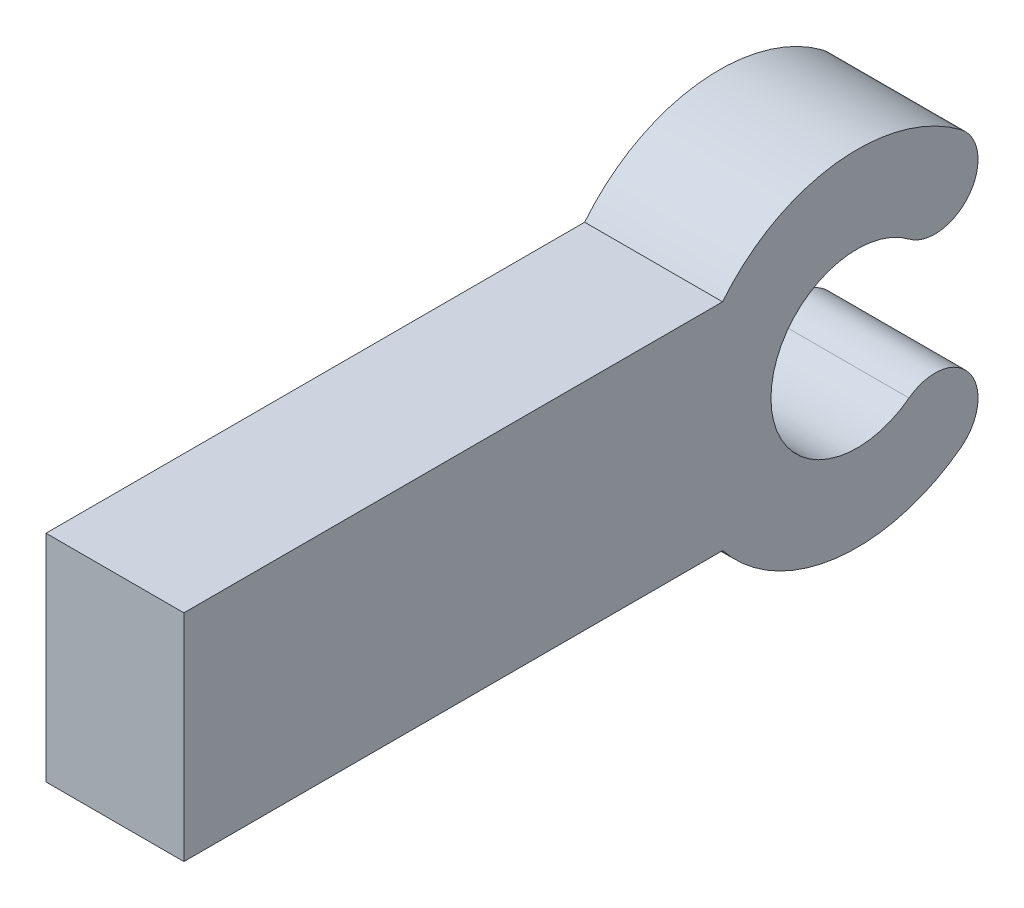
ISO-10303-21;
HEADER;
FILE_DESCRIPTION(('STEP AP214'),'2;1');
FILE_NAME('part.step','',(''),(''),'','','');
FILE_SCHEMA(('AUTOMOTIVE_DESIGN { 1 0 10303 214 1 1 1 1 }'));
ENDSEC;
DATA;
#1=APPLICATION_CONTEXT('core data for automotive mechanical design processes');
#2=APPLICATION_PROTOCOL_DEFINITION('international standard','automotive_design',2000,#1);
#3=PRODUCT_CONTEXT('',#1,'mechanical');
#4=PRODUCT('Part','Part','',(#3));
#5=PRODUCT_RELATED_PRODUCT_CATEGORY('part','',(#4));
#6=PRODUCT_DEFINITION_FORMATION('','',#4);
#7=PRODUCT_DEFINITION_CONTEXT('part definition',#1,'design');
#8=PRODUCT_DEFINITION('design','',#6,#7);
#9=PRODUCT_DEFINITION_SHAPE('','',#8);
#10=(LENGTH_UNIT() NAMED_UNIT(*) SI_UNIT(.MILLI.,.METRE.));
#11=(NAMED_UNIT(*) PLANE_ANGLE_UNIT() SI_UNIT($,.RADIAN.));
#12=(NAMED_UNIT(*) SI_UNIT($,.STERADIAN.) SOLID_ANGLE_UNIT());
#13=UNCERTAINTY_MEASURE_WITH_UNIT(LENGTH_MEASURE(1.E-05),#10,'distance_accuracy_value','');
#14=(GEOMETRIC_REPRESENTATION_CONTEXT(3) GLOBAL_UNCERTAINTY_ASSIGNED_CONTEXT((#13)) GLOBAL_UNIT_ASSIGNED_CONTEXT((#10,
#11,#12)) REPRESENTATION_CONTEXT('',''));
#15=CARTESIAN_POINT('',(0.,0.,0.));
#16=DIRECTION('',(0.,0.,1.));
#17=DIRECTION('',(1.,0.,0.));
#18=AXIS2_PLACEMENT_3D('',#15,#16,#17);
#19=CARTESIAN_POINT('',(1.6256,0.,0.));
#20=DIRECTION('',(0.,0.,-1.));
#21=DIRECTION('',(-1.,0.,0.));
#22=AXIS2_PLACEMENT_3D('',#19,#20,#21);
#23=PLANE('',#22);
#24=DIRECTION('',(0.,-1.,0.));
#25=VECTOR('',#24,1.);
#26=CARTESIAN_POINT('',(0.,0.,0.));
#27=LINE('',#26,#25);
#28=CARTESIAN_POINT('',(0.,2.54,0.));
#29=VERTEX_POINT('',#28);
#30=CARTESIAN_POINT('',(0.,0.,0.));
#31=VERTEX_POINT('',#30);
#32=EDGE_CURVE('E128',#29,#31,#27,.T.);
#33=ORIENTED_EDGE('',*,*,#32,.T.);
#34=DIRECTION('',(-1.,0.,0.));
#35=VECTOR('',#34,1.);
#36=CARTESIAN_POINT('',(1.6256,0.,0.));
#37=LINE('',#36,#35);
#38=CARTESIAN_POINT('',(1.6256,0.,0.));
#39=VERTEX_POINT('',#38);
#40=EDGE_CURVE('E11',#39,#31,#37,.T.);
#41=ORIENTED_EDGE('',*,*,#40,.F.);
#42=DIRECTION('',(0.,-1.,0.));
#43=VECTOR('',#42,1.);
#44=CARTESIAN_POINT('',(1.6256,0.,0.));
#45=LINE('',#44,#43);
#46=CARTESIAN_POINT('',(1.6256,2.54,0.));
#47=VERTEX_POINT('',#46);
#48=EDGE_CURVE('E142',#47,#39,#45,.T.);
#49=ORIENTED_EDGE('',*,*,#48,.F.);
#50=DIRECTION('',(-1.,0.,0.));
#51=VECTOR('',#50,1.);
#52=CARTESIAN_POINT('',(1.6256,2.54,0.));
#53=LINE('',#52,#51);
#54=EDGE_CURVE('E124',#47,#29,#53,.T.);
#55=ORIENTED_EDGE('',*,*,#54,.T.);
#56=EDGE_LOOP('',(#33,#41,#49,#55));
#57=FACE_BOUND('',#56,.T.);
#58=ADVANCED_FACE('F32',(#57),#23,.F.);
#59=CARTESIAN_POINT('',(1.6256,0.,0.));
#60=DIRECTION('',(0.,1.,0.));
#61=DIRECTION('',(0.,0.,1.));
#62=AXIS2_PLACEMENT_3D('',#59,#60,#61);
#63=PLANE('',#62);
#64=DIRECTION('',(0.,0.,-1.));
#65=VECTOR('',#64,1.);
#66=CARTESIAN_POINT('',(0.,0.,0.));
#67=LINE('',#66,#65);
#68=CARTESIAN_POINT('',(0.,0.,-6.35));
#69=VERTEX_POINT('',#68);
#70=EDGE_CURVE('E131',#31,#69,#67,.T.);
#71=ORIENTED_EDGE('',*,*,#70,.T.);
#72=DIRECTION('',(-1.,0.,0.));
#73=VECTOR('',#72,1.);
#74=CARTESIAN_POINT('',(1.6256,0.,-6.35));
#75=LINE('',#74,#73);
#76=CARTESIAN_POINT('',(1.6256,0.,-6.35));
#77=VERTEX_POINT('',#76);
#78=EDGE_CURVE('E40',#77,#69,#75,.T.);
#79=ORIENTED_EDGE('',*,*,#78,.F.);
#80=DIRECTION('',(0.,0.,-1.));
#81=VECTOR('',#80,1.);
#82=CARTESIAN_POINT('',(1.6256,0.,0.));
#83=LINE('',#82,#81);
#84=EDGE_CURVE('E91',#39,#77,#83,.T.);
#85=ORIENTED_EDGE('',*,*,#84,.F.);
#86=ORIENTED_EDGE('',*,*,#40,.T.);
#87=EDGE_LOOP('',(#71,#79,#85,#86));
#88=FACE_BOUND('',#87,.T.);
#89=ADVANCED_FACE('F177',(#88),#63,.F.);
#90=CARTESIAN_POINT('',(1.6256,1.27,-7.93622949159319));
#91=DIRECTION('',(-1.,0.,0.));
#92=DIRECTION('',(0.,0.,1.));
#93=AXIS2_PLACEMENT_3D('',#90,#91,#92);
#94=CYLINDRICAL_SURFACE('',#93,2.032);
#95=CARTESIAN_POINT('',(0.,1.27,-7.93622949159319));
#96=DIRECTION('',(1.,0.,0.));
#97=DIRECTION('',(0.,0.,-1.));
#98=AXIS2_PLACEMENT_3D('',#95,#96,#97);
#99=CIRCLE('',#98,2.032);
#100=CARTESIAN_POINT('',(0.,-0.352827356416102,-9.15911761863815));
#101=VERTEX_POINT('',#100);
#102=EDGE_CURVE('E133',#69,#101,#99,.T.);
#103=ORIENTED_EDGE('',*,*,#102,.T.);
#104=DIRECTION('',(-1.,0.,0.));
#105=VECTOR('',#104,1.);
#106=CARTESIAN_POINT('',(1.6256,-0.352827356416102,-9.15911761863815));
#107=LINE('',#106,#105);
#108=CARTESIAN_POINT('',(1.6256,-0.352827356416102,-9.15911761863815));
#109=VERTEX_POINT('',#108);
#110=EDGE_CURVE('E149',#109,#101,#107,.T.);
#111=ORIENTED_EDGE('',*,*,#110,.F.);
#112=CARTESIAN_POINT('',(1.6256,1.27,-7.93622949159319));
#113=DIRECTION('',(1.,0.,0.));
#114=DIRECTION('',(0.,0.,-1.));
#115=AXIS2_PLACEMENT_3D('',#112,#113,#114);
#116=CIRCLE('',#115,2.032);
#117=EDGE_CURVE('E157',#77,#109,#116,.T.);
#118=ORIENTED_EDGE('',*,*,#117,.F.);
#119=ORIENTED_EDGE('',*,*,#78,.T.);
#120=EDGE_LOOP('',(#103,#111,#118,#119));
#121=FACE_BOUND('',#120,.T.);
#122=ADVANCED_FACE('F155',(#121),#94,.T.);
#123=CARTESIAN_POINT('',(1.6256,0.0528794826879236,-8.85339558687691));
#124=DIRECTION('',(-1.,0.,0.));
#125=DIRECTION('',(0.,0.,1.));
#126=AXIS2_PLACEMENT_3D('',#123,#124,#125);
#127=CYLINDRICAL_SURFACE('',#126,0.508000000000001);
#128=CARTESIAN_POINT('',(0.,0.0528794826879236,-8.85339558687691));
#129=DIRECTION('',(1.,0.,0.));
#130=DIRECTION('',(0.,0.,1.));
#131=AXIS2_PLACEMENT_3D('',#128,#129,#130);
#132=CIRCLE('',#131,0.508000000000001);
#133=CARTESIAN_POINT('',(0.,0.458586321791949,-8.54767355511567));
#134=VERTEX_POINT('',#133);
#135=EDGE_CURVE('E135',#101,#134,#132,.T.);
#136=ORIENTED_EDGE('',*,*,#135,.T.);
#137=DIRECTION('',(-1.,0.,0.));
#138=VECTOR('',#137,1.);
#139=CARTESIAN_POINT('',(1.6256,0.458586321791949,-8.54767355511567));
#140=LINE('',#139,#138);
#141=CARTESIAN_POINT('',(1.6256,0.458586321791949,-8.54767355511567));
#142=VERTEX_POINT('',#141);
#143=EDGE_CURVE('E146',#142,#134,#140,.T.);
#144=ORIENTED_EDGE('',*,*,#143,.F.);
#145=CARTESIAN_POINT('',(1.6256,0.0528794826879236,-8.85339558687691));
#146=DIRECTION('',(1.,0.,0.));
#147=DIRECTION('',(0.,0.,1.));
#148=AXIS2_PLACEMENT_3D('',#145,#146,#147);
#149=CIRCLE('',#148,0.508000000000001);
#150=EDGE_CURVE('E169',#109,#142,#149,.T.);
#151=ORIENTED_EDGE('',*,*,#150,.F.);
#152=ORIENTED_EDGE('',*,*,#110,.T.);
#153=EDGE_LOOP('',(#136,#144,#151,#152));
#154=FACE_BOUND('',#153,.T.);
#155=ADVANCED_FACE('F165',(#154),#127,.T.);
#156=CARTESIAN_POINT('',(1.6256,1.27,-7.93622949159319));
#157=DIRECTION('',(-1.,0.,0.));
#158=DIRECTION('',(0.,0.,1.));
#159=AXIS2_PLACEMENT_3D('',#156,#157,#158);
#160=CYLINDRICAL_SURFACE('',#159,1.016);
#161=CARTESIAN_POINT('',(0.,1.27,-7.93622949159319));
#162=DIRECTION('',(-1.,0.,0.));
#163=DIRECTION('',(0.,0.,-1.));
#164=AXIS2_PLACEMENT_3D('',#161,#162,#163);
#165=CIRCLE('',#164,1.016);
#166=CARTESIAN_POINT('',(0.,2.08141367820805,-8.54767355511567));
#167=VERTEX_POINT('',#166);
#168=EDGE_CURVE('E137',#134,#167,#165,.T.);
#169=ORIENTED_EDGE('',*,*,#168,.T.);
#170=DIRECTION('',(-1.,0.,0.));
#171=VECTOR('',#170,1.);
#172=CARTESIAN_POINT('',(1.6256,2.08141367820805,-8.54767355511567));
#173=LINE('',#172,#171);
#174=CARTESIAN_POINT('',(1.6256,2.08141367820805,-8.54767355511567));
#175=VERTEX_POINT('',#174);
#176=EDGE_CURVE('E119',#175,#167,#173,.T.);
#177=ORIENTED_EDGE('',*,*,#176,.F.);
#178=CARTESIAN_POINT('',(1.6256,1.27,-7.93622949159319));
#179=DIRECTION('',(-1.,0.,0.));
#180=DIRECTION('',(0.,0.,-1.));
#181=AXIS2_PLACEMENT_3D('',#178,#179,#180);
#182=CIRCLE('',#181,1.016);
#183=EDGE_CURVE('E110',#142,#175,#182,.T.);
#184=ORIENTED_EDGE('',*,*,#183,.F.);
#185=ORIENTED_EDGE('',*,*,#143,.T.);
#186=EDGE_LOOP('',(#169,#177,#184,#185));
#187=FACE_BOUND('',#186,.T.);
#188=ADVANCED_FACE('F168',(#187),#160,.F.);
#189=CARTESIAN_POINT('',(1.6256,2.48712051731208,-8.85339558687691));
#190=DIRECTION('',(-1.,0.,0.));
#191=DIRECTION('',(0.,0.,1.));
#192=AXIS2_PLACEMENT_3D('',#189,#190,#191);
#193=CYLINDRICAL_SURFACE('',#192,0.508);
#194=CARTESIAN_POINT('',(0.,2.48712051731208,-8.85339558687691));
#195=DIRECTION('',(1.,0.,0.));
#196=DIRECTION('',(0.,0.,1.));
#197=AXIS2_PLACEMENT_3D('',#194,#195,#196);
#198=CIRCLE('',#197,0.508);
#199=CARTESIAN_POINT('',(0.,2.8928273564161,-9.15911761863815));
#200=VERTEX_POINT('',#199);
#201=EDGE_CURVE('E118',#167,#200,#198,.T.);
#202=ORIENTED_EDGE('',*,*,#201,.T.);
#203=DIRECTION('',(-1.,0.,0.));
#204=VECTOR('',#203,1.);
#205=CARTESIAN_POINT('',(1.6256,2.8928273564161,-9.15911761863815));
#206=LINE('',#205,#204);
#207=CARTESIAN_POINT('',(1.6256,2.8928273564161,-9.15911761863815));
#208=VERTEX_POINT('',#207);
#209=EDGE_CURVE('E115',#208,#200,#206,.T.);
#210=ORIENTED_EDGE('',*,*,#209,.F.);
#211=CARTESIAN_POINT('',(1.6256,2.48712051731208,-8.85339558687691));
#212=DIRECTION('',(1.,0.,0.));
#213=DIRECTION('',(0.,0.,1.));
#214=AXIS2_PLACEMENT_3D('',#211,#212,#213);
#215=CIRCLE('',#214,0.508);
#216=EDGE_CURVE('E104',#175,#208,#215,.T.);
#217=ORIENTED_EDGE('',*,*,#216,.F.);
#218=ORIENTED_EDGE('',*,*,#176,.T.);
#219=EDGE_LOOP('',(#202,#210,#217,#218));
#220=FACE_BOUND('',#219,.T.);
#221=ADVANCED_FACE('F116',(#220),#193,.T.);
#222=CARTESIAN_POINT('',(1.6256,1.27,-7.93622949159319));
#223=DIRECTION('',(-1.,0.,0.));
#224=DIRECTION('',(0.,0.,1.));
#225=AXIS2_PLACEMENT_3D('',#222,#223,#224);
#226=CYLINDRICAL_SURFACE('',#225,2.032);
#227=CARTESIAN_POINT('',(0.,1.27,-7.93622949159319));
#228=DIRECTION('',(1.,0.,0.));
#229=DIRECTION('',(0.,0.,-1.));
#230=AXIS2_PLACEMENT_3D('',#227,#228,#229);
#231=CIRCLE('',#230,2.032);
#232=CARTESIAN_POINT('',(0.,2.54,-6.35));
#233=VERTEX_POINT('',#232);
#234=EDGE_CURVE('E77',#200,#233,#231,.T.);
#235=ORIENTED_EDGE('',*,*,#234,.T.);
#236=DIRECTION('',(-1.,0.,0.));
#237=VECTOR('',#236,1.);
#238=CARTESIAN_POINT('',(1.6256,2.54,-6.35));
#239=LINE('',#238,#237);
#240=CARTESIAN_POINT('',(1.6256,2.54,-6.35));
#241=VERTEX_POINT('',#240);
#242=EDGE_CURVE('E120',#241,#233,#239,.T.);
#243=ORIENTED_EDGE('',*,*,#242,.F.);
#244=CARTESIAN_POINT('',(1.6256,1.27,-7.93622949159319));
#245=DIRECTION('',(1.,0.,0.));
#246=DIRECTION('',(0.,0.,-1.));
#247=AXIS2_PLACEMENT_3D('',#244,#245,#246);
#248=CIRCLE('',#247,2.032);
#249=EDGE_CURVE('E108',#208,#241,#248,.T.);
#250=ORIENTED_EDGE('',*,*,#249,.F.);
#251=ORIENTED_EDGE('',*,*,#209,.T.);
#252=EDGE_LOOP('',(#235,#243,#250,#251));
#253=FACE_BOUND('',#252,.T.);
#254=ADVANCED_FACE('F122',(#253),#226,.T.);
#255=CARTESIAN_POINT('',(1.6256,2.54,0.));
#256=DIRECTION('',(0.,-1.,0.));
#257=DIRECTION('',(0.,0.,-1.));
#258=AXIS2_PLACEMENT_3D('',#255,#256,#257);
#259=PLANE('',#258);
#260=DIRECTION('',(0.,0.,1.));
#261=VECTOR('',#260,1.);
#262=CARTESIAN_POINT('',(0.,2.54,0.));
#263=LINE('',#262,#261);
#264=EDGE_CURVE('E83',#233,#29,#263,.T.);
#265=ORIENTED_EDGE('',*,*,#264,.T.);
#266=ORIENTED_EDGE('',*,*,#54,.F.);
#267=DIRECTION('',(0.,0.,1.));
#268=VECTOR('',#267,1.);
#269=CARTESIAN_POINT('',(1.6256,2.54,0.));
#270=LINE('',#269,#268);
#271=EDGE_CURVE('E48',#241,#47,#270,.T.);
#272=ORIENTED_EDGE('',*,*,#271,.F.);
#273=ORIENTED_EDGE('',*,*,#242,.T.);
#274=EDGE_LOOP('',(#265,#266,#272,#273));
#275=FACE_BOUND('',#274,.T.);
#276=ADVANCED_FACE('F193',(#275),#259,.F.);
#277=CARTESIAN_POINT('',(1.6256,1.27,-7.93622949159319));
#278=DIRECTION('',(1.,0.,0.));
#279=DIRECTION('',(0.,0.,-1.));
#280=AXIS2_PLACEMENT_3D('',#277,#278,#279);
#281=PLANE('',#280);
#282=ORIENTED_EDGE('',*,*,#48,.T.);
#283=ORIENTED_EDGE('',*,*,#84,.T.);
#284=ORIENTED_EDGE('',*,*,#117,.T.);
#285=ORIENTED_EDGE('',*,*,#150,.T.);
#286=ORIENTED_EDGE('',*,*,#183,.T.);
#287=ORIENTED_EDGE('',*,*,#216,.T.);
#288=ORIENTED_EDGE('',*,*,#249,.T.);
#289=ORIENTED_EDGE('',*,*,#271,.T.);
#290=EDGE_LOOP('',(#282,#283,#284,#285,#286,#287,#288,#289));
#291=FACE_BOUND('',#290,.T.);
#292=ADVANCED_FACE('F106',(#291),#281,.T.);
#293=CARTESIAN_POINT('',(0.,1.27,-7.93622949159319));
#294=DIRECTION('',(1.,0.,0.));
#295=DIRECTION('',(0.,0.,-1.));
#296=AXIS2_PLACEMENT_3D('',#293,#294,#295);
#297=PLANE('',#296);
#298=ORIENTED_EDGE('',*,*,#32,.F.);
#299=ORIENTED_EDGE('',*,*,#264,.F.);
#300=ORIENTED_EDGE('',*,*,#234,.F.);
#301=ORIENTED_EDGE('',*,*,#201,.F.);
#302=ORIENTED_EDGE('',*,*,#168,.F.);
#303=ORIENTED_EDGE('',*,*,#135,.F.);
#304=ORIENTED_EDGE('',*,*,#102,.F.);
#305=ORIENTED_EDGE('',*,*,#70,.F.);
#306=EDGE_LOOP('',(#298,#299,#300,#301,#302,#303,#304,#305));
#307=FACE_BOUND('',#306,.T.);
#308=ADVANCED_FACE('F161',(#307),#297,.F.);
#309=CLOSED_SHELL('',(#58,#89,#122,#155,#188,#221,#254,#276,#292,#308));
#310=MANIFOLD_SOLID_BREP('B2',#309);
#311=ADVANCED_BREP_SHAPE_REPRESENTATION('',(#18,#310),#14);
#312=SHAPE_DEFINITION_REPRESENTATION(#9,#311);
ENDSEC;
END-ISO-10303-21;
